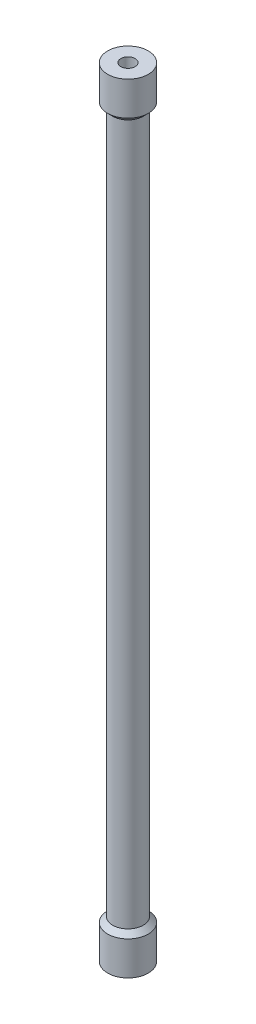
ISO-10303-21;
HEADER;
FILE_DESCRIPTION(('STEP AP214'),'2;1');
FILE_NAME('part.step','',(''),(''),'','','');
FILE_SCHEMA(('AUTOMOTIVE_DESIGN { 1 0 10303 214 1 1 1 1 }'));
ENDSEC;
DATA;
#1=APPLICATION_CONTEXT('core data for automotive mechanical design processes');
#2=APPLICATION_PROTOCOL_DEFINITION('international standard','automotive_design',2000,#1);
#3=PRODUCT_CONTEXT('',#1,'mechanical');
#4=PRODUCT('Part','Part','',(#3));
#5=PRODUCT_RELATED_PRODUCT_CATEGORY('part','',(#4));
#6=PRODUCT_DEFINITION_FORMATION('','',#4);
#7=PRODUCT_DEFINITION_CONTEXT('part definition',#1,'design');
#8=PRODUCT_DEFINITION('design','',#6,#7);
#9=PRODUCT_DEFINITION_SHAPE('','',#8);
#10=(LENGTH_UNIT() NAMED_UNIT(*) SI_UNIT(.MILLI.,.METRE.));
#11=(NAMED_UNIT(*) PLANE_ANGLE_UNIT() SI_UNIT($,.RADIAN.));
#12=(NAMED_UNIT(*) SI_UNIT($,.STERADIAN.) SOLID_ANGLE_UNIT());
#13=UNCERTAINTY_MEASURE_WITH_UNIT(LENGTH_MEASURE(1.E-05),#10,'distance_accuracy_value','');
#14=(GEOMETRIC_REPRESENTATION_CONTEXT(3) GLOBAL_UNCERTAINTY_ASSIGNED_CONTEXT((#13)) GLOBAL_UNIT_ASSIGNED_CONTEXT((#10,
#11,#12)) REPRESENTATION_CONTEXT('',''));
#15=CARTESIAN_POINT('',(0.,0.,0.));
#16=DIRECTION('',(0.,0.,1.));
#17=DIRECTION('',(1.,0.,0.));
#18=AXIS2_PLACEMENT_3D('',#15,#16,#17);
#19=CARTESIAN_POINT('',(0.,-115.,0.));
#20=DIRECTION('',(0.,1.,0.));
#21=DIRECTION('',(0.,0.,1.));
#22=AXIS2_PLACEMENT_3D('',#19,#20,#21);
#23=PLANE('',#22);
#24=CARTESIAN_POINT('',(0.,-115.,0.));
#25=DIRECTION('',(0.,1.,0.));
#26=DIRECTION('',(0.,0.,1.));
#27=AXIS2_PLACEMENT_3D('',#24,#25,#26);
#28=CIRCLE('',#27,6.);
#29=CARTESIAN_POINT('',(0.,-115.,6.));
#30=VERTEX_POINT('',#29);
#31=EDGE_CURVE('E82',#30,#30,#28,.T.);
#32=ORIENTED_EDGE('',*,*,#31,.F.);
#33=EDGE_LOOP('',(#32));
#34=FACE_BOUND('',#33,.T.);
#35=CARTESIAN_POINT('',(0.,-115.,0.));
#36=DIRECTION('',(0.,-1.,0.));
#37=DIRECTION('',(0.,0.,-1.));
#38=AXIS2_PLACEMENT_3D('',#35,#36,#37);
#39=CIRCLE('',#38,2.09999999999999);
#40=CARTESIAN_POINT('',(0.,-115.,-2.09999999999999));
#41=VERTEX_POINT('',#40);
#42=EDGE_CURVE('E65',#41,#41,#39,.T.);
#43=ORIENTED_EDGE('',*,*,#42,.F.);
#44=EDGE_LOOP('',(#43));
#45=FACE_BOUND('',#44,.T.);
#46=ADVANCED_FACE('F41',(#34,#45),#23,.F.);
#47=CARTESIAN_POINT('',(0.,115.,0.));
#48=DIRECTION('',(0.,-1.,0.));
#49=DIRECTION('',(0.,0.,-1.));
#50=AXIS2_PLACEMENT_3D('',#47,#48,#49);
#51=CYLINDRICAL_SURFACE('',#50,6.);
#52=CARTESIAN_POINT('',(0.,115.,0.));
#53=DIRECTION('',(0.,1.,0.));
#54=DIRECTION('',(0.,0.,1.));
#55=AXIS2_PLACEMENT_3D('',#52,#53,#54);
#56=CIRCLE('',#55,6.);
#57=CARTESIAN_POINT('',(0.,115.,6.));
#58=VERTEX_POINT('',#57);
#59=EDGE_CURVE('E83',#58,#58,#56,.T.);
#60=ORIENTED_EDGE('',*,*,#59,.F.);
#61=EDGE_LOOP('',(#60));
#62=FACE_BOUND('',#61,.T.);
#63=CARTESIAN_POINT('',(0.,105.,0.));
#64=DIRECTION('',(0.,1.,0.));
#65=DIRECTION('',(0.,0.,1.));
#66=AXIS2_PLACEMENT_3D('',#63,#64,#65);
#67=CIRCLE('',#66,6.);
#68=CARTESIAN_POINT('',(0.,105.,5.99999999999996));
#69=VERTEX_POINT('',#68);
#70=EDGE_CURVE('E79',#69,#69,#67,.T.);
#71=ORIENTED_EDGE('',*,*,#70,.T.);
#72=EDGE_LOOP('',(#71));
#73=FACE_BOUND('',#72,.T.);
#74=ADVANCED_FACE('F98',(#62,#73),#51,.T.);
#75=CARTESIAN_POINT('',(0.,115.,0.));
#76=DIRECTION('',(0.,1.,0.));
#77=DIRECTION('',(0.,0.,1.));
#78=AXIS2_PLACEMENT_3D('',#75,#76,#77);
#79=PLANE('',#78);
#80=CARTESIAN_POINT('',(0.,115.,0.));
#81=DIRECTION('',(0.,1.,0.));
#82=DIRECTION('',(0.,0.,1.));
#83=AXIS2_PLACEMENT_3D('',#80,#81,#82);
#84=CIRCLE('',#83,2.09999999999999);
#85=CARTESIAN_POINT('',(0.,115.,2.09999999999999));
#86=VERTEX_POINT('',#85);
#87=EDGE_CURVE('E66',#86,#86,#84,.T.);
#88=ORIENTED_EDGE('',*,*,#87,.F.);
#89=EDGE_LOOP('',(#88));
#90=FACE_BOUND('',#89,.T.);
#91=ORIENTED_EDGE('',*,*,#59,.T.);
#92=EDGE_LOOP('',(#91));
#93=FACE_BOUND('',#92,.T.);
#94=ADVANCED_FACE('F100',(#90,#93),#79,.T.);
#95=CARTESIAN_POINT('',(0.,115.,0.));
#96=DIRECTION('',(0.,1.,0.));
#97=DIRECTION('',(0.,0.,1.));
#98=AXIS2_PLACEMENT_3D('',#95,#96,#97);
#99=CYLINDRICAL_SURFACE('',#98,4.49999999999999);
#100=CARTESIAN_POINT('',(0.,-103.5,0.));
#101=DIRECTION('',(0.,1.,0.));
#102=DIRECTION('',(0.,0.,1.));
#103=AXIS2_PLACEMENT_3D('',#100,#101,#102);
#104=CIRCLE('',#103,4.49999999999999);
#105=CARTESIAN_POINT('',(0.,-103.5,4.49999999999999));
#106=VERTEX_POINT('',#105);
#107=EDGE_CURVE('E11',#106,#106,#104,.T.);
#108=ORIENTED_EDGE('',*,*,#107,.T.);
#109=EDGE_LOOP('',(#108));
#110=FACE_BOUND('',#109,.T.);
#111=CARTESIAN_POINT('',(0.,103.5,0.));
#112=DIRECTION('',(0.,-1.,0.));
#113=DIRECTION('',(0.,0.,-1.));
#114=AXIS2_PLACEMENT_3D('',#111,#112,#113);
#115=CIRCLE('',#114,4.49999999999999);
#116=CARTESIAN_POINT('',(0.,103.5,4.49999999999999));
#117=VERTEX_POINT('',#116);
#118=EDGE_CURVE('E49',#117,#117,#115,.T.);
#119=ORIENTED_EDGE('',*,*,#118,.T.);
#120=EDGE_LOOP('',(#119));
#121=FACE_BOUND('',#120,.T.);
#122=ADVANCED_FACE('F90',(#110,#121),#99,.T.);
#123=ORIENTED_EDGE('',*,*,#31,.T.);
#124=EDGE_LOOP('',(#123));
#125=FACE_BOUND('',#124,.T.);
#126=CARTESIAN_POINT('',(0.,-105.,0.));
#127=DIRECTION('',(0.,1.,0.));
#128=DIRECTION('',(0.,0.,1.));
#129=AXIS2_PLACEMENT_3D('',#126,#127,#128);
#130=CIRCLE('',#129,6.);
#131=CARTESIAN_POINT('',(0.,-105.,6.));
#132=VERTEX_POINT('',#131);
#133=EDGE_CURVE('E76',#132,#132,#130,.T.);
#134=ORIENTED_EDGE('',*,*,#133,.F.);
#135=EDGE_LOOP('',(#134));
#136=FACE_BOUND('',#135,.T.);
#137=ADVANCED_FACE('F103',(#125,#136),#51,.T.);
#138=CARTESIAN_POINT('',(0.,-103.5,0.));
#139=DIRECTION('',(0.,-1.,0.));
#140=DIRECTION('',(0.,0.,-1.));
#141=AXIS2_PLACEMENT_3D('',#138,#139,#140);
#142=CONICAL_SURFACE('',#141,4.49999999999999,0.785398163397435);
#143=ORIENTED_EDGE('',*,*,#133,.T.);
#144=EDGE_LOOP('',(#143));
#145=FACE_BOUND('',#144,.T.);
#146=ORIENTED_EDGE('',*,*,#107,.F.);
#147=EDGE_LOOP('',(#146));
#148=FACE_BOUND('',#147,.T.);
#149=ADVANCED_FACE('F95',(#145,#148),#142,.T.);
#150=CARTESIAN_POINT('',(0.,105.,0.));
#151=DIRECTION('',(0.,1.,0.));
#152=DIRECTION('',(0.,0.,1.));
#153=AXIS2_PLACEMENT_3D('',#150,#151,#152);
#154=CONICAL_SURFACE('',#153,5.99999999999995,0.78539816339744);
#155=CARTESIAN_POINT('',(0.,103.5,4.49999999999999));
#156=CARTESIAN_POINT('',(0.,103.515625,4.51562499999999));
#157=CARTESIAN_POINT('',(0.,103.53125,4.53124999999999));
#158=CARTESIAN_POINT('',(0.,103.5625,4.56249999999999));
#159=CARTESIAN_POINT('',(0.,103.578125,4.57812499999999));
#160=CARTESIAN_POINT('',(0.,103.609375,4.60937499999999));
#161=CARTESIAN_POINT('',(0.,103.625,4.62499999999999));
#162=CARTESIAN_POINT('',(0.,103.65625,4.65624999999999));
#163=CARTESIAN_POINT('',(0.,103.671875,4.67187499999999));
#164=CARTESIAN_POINT('',(0.,103.703125,4.70312499999999));
#165=CARTESIAN_POINT('',(0.,103.71875,4.71874999999999));
#166=CARTESIAN_POINT('',(0.,103.75,4.74999999999999));
#167=CARTESIAN_POINT('',(0.,103.765625,4.76562499999999));
#168=CARTESIAN_POINT('',(0.,103.796875,4.79687499999998));
#169=CARTESIAN_POINT('',(0.,103.8125,4.81249999999999));
#170=CARTESIAN_POINT('',(0.,103.84375,4.84374999999999));
#171=CARTESIAN_POINT('',(0.,103.859375,4.85937499999998));
#172=CARTESIAN_POINT('',(0.,103.890625,4.89062499999998));
#173=CARTESIAN_POINT('',(0.,103.90625,4.90624999999998));
#174=CARTESIAN_POINT('',(0.,103.9375,4.93749999999998));
#175=CARTESIAN_POINT('',(0.,103.953125,4.95312499999998));
#176=CARTESIAN_POINT('',(0.,103.984375,4.98437499999998));
#177=CARTESIAN_POINT('',(0.,104.,4.99999999999998));
#178=CARTESIAN_POINT('',(0.,104.03125,5.03124999999998));
#179=CARTESIAN_POINT('',(0.,104.046875,5.04687499999998));
#180=CARTESIAN_POINT('',(0.,104.078125,5.07812499999998));
#181=CARTESIAN_POINT('',(0.,104.09375,5.09374999999998));
#182=CARTESIAN_POINT('',(0.,104.125,5.12499999999998));
#183=CARTESIAN_POINT('',(0.,104.140625,5.14062499999998));
#184=CARTESIAN_POINT('',(0.,104.171875,5.17187499999998));
#185=CARTESIAN_POINT('',(0.,104.1875,5.18749999999998));
#186=CARTESIAN_POINT('',(0.,104.21875,5.21874999999998));
#187=CARTESIAN_POINT('',(0.,104.234375,5.23437499999998));
#188=CARTESIAN_POINT('',(0.,104.265625,5.26562499999998));
#189=CARTESIAN_POINT('',(0.,104.28125,5.28124999999997));
#190=CARTESIAN_POINT('',(0.,104.3125,5.31249999999997));
#191=CARTESIAN_POINT('',(0.,104.328125,5.32812499999997));
#192=CARTESIAN_POINT('',(0.,104.359375,5.35937499999997));
#193=CARTESIAN_POINT('',(0.,104.375,5.37499999999997));
#194=CARTESIAN_POINT('',(0.,104.40625,5.40624999999997));
#195=CARTESIAN_POINT('',(0.,104.421875,5.42187499999997));
#196=CARTESIAN_POINT('',(0.,104.453125,5.45312499999997));
#197=CARTESIAN_POINT('',(0.,104.46875,5.46874999999997));
#198=CARTESIAN_POINT('',(0.,104.5,5.49999999999997));
#199=CARTESIAN_POINT('',(0.,104.515625,5.51562499999997));
#200=CARTESIAN_POINT('',(0.,104.546875,5.54687499999997));
#201=CARTESIAN_POINT('',(0.,104.5625,5.56249999999997));
#202=CARTESIAN_POINT('',(0.,104.59375,5.59374999999997));
#203=CARTESIAN_POINT('',(0.,104.609375,5.60937499999997));
#204=CARTESIAN_POINT('',(0.,104.640625,5.64062499999997));
#205=CARTESIAN_POINT('',(0.,104.65625,5.65624999999996));
#206=CARTESIAN_POINT('',(0.,104.6875,5.68749999999996));
#207=CARTESIAN_POINT('',(0.,104.703125,5.70312499999997));
#208=CARTESIAN_POINT('',(0.,104.734375,5.73437499999996));
#209=CARTESIAN_POINT('',(0.,104.75,5.74999999999996));
#210=CARTESIAN_POINT('',(0.,104.78125,5.78124999999996));
#211=CARTESIAN_POINT('',(0.,104.796875,5.79687499999996));
#212=CARTESIAN_POINT('',(0.,104.828125,5.82812499999996));
#213=CARTESIAN_POINT('',(0.,104.84375,5.84374999999996));
#214=CARTESIAN_POINT('',(0.,104.875,5.87499999999996));
#215=CARTESIAN_POINT('',(0.,104.890625,5.89062499999996));
#216=CARTESIAN_POINT('',(0.,104.921875,5.92187499999996));
#217=CARTESIAN_POINT('',(0.,104.9375,5.93749999999996));
#218=CARTESIAN_POINT('',(0.,104.96875,5.96874999999996));
#219=CARTESIAN_POINT('',(0.,104.984375,5.98437499999995));
#220=CARTESIAN_POINT('',(0.,105.,5.99999999999996));
#221=B_SPLINE_CURVE_WITH_KNOTS('',3,(#155,#156,#157,#158,#159,#160,#161,#162,#163,#164,#165,
#166,#167,#168,#169,#170,#171,#172,#173,#174,#175,#176,#177,#178,#179,#180,#181,#182,#183,#184,
#185,#186,#187,#188,#189,#190,#191,#192,#193,#194,#195,#196,#197,#198,#199,#200,#201,#202,#203,
#204,#205,#206,#207,#208,#209,#210,#211,#212,#213,#214,#215,#216,#217,#218,#219,#220),
.UNSPECIFIED.,.F.,.F.,(4,2,2,2,2,2,2,2,2,2,2,2,2,2,2,2,2,2,2,2,2,2,2,2,2,2,2,2,2,2,2,2,4),(0.,
0.0662912607362395,0.132582521472479,0.198873782208718,0.265165042944957,0.331456303681196,
0.397747564417436,0.464038825153665,0.530330085889904,0.596621346626144,0.662912607362383,
0.729203868098622,0.795495128834862,0.861786389571091,0.92807765030733,0.99436891104357,
1.06066017177981,1.12695143251605,1.19324269325229,1.25953395398853,1.32582521472476,
1.39211647546099,1.45840773619723,1.52469899693347,1.59099025766971,1.65728151840595,
1.72357277914218,1.78986403987842,1.85615530061466,1.9224465613509,1.98873782208714,
2.05502908282338,2.12132034355961),.UNSPECIFIED.);
#222=EDGE_CURVE('BSEAM43',#117,#69,#221,.T.);
#223=ORIENTED_EDGE('',*,*,#118,.F.);
#224=ORIENTED_EDGE('',*,*,#70,.F.);
#225=ORIENTED_EDGE('',*,*,#222,.T.);
#226=ORIENTED_EDGE('',*,*,#222,.F.);
#227=EDGE_LOOP('',(#223,#225,#224,#226));
#228=FACE_BOUND('',#227,.T.);
#229=ADVANCED_FACE('F43',(#228),#154,.T.);
#230=CARTESIAN_POINT('',(0.,-97.6,0.));
#231=DIRECTION('',(0.,-1.,0.));
#232=DIRECTION('',(0.,0.,-1.));
#233=AXIS2_PLACEMENT_3D('',#230,#231,#232);
#234=CONICAL_SURFACE('',#233,2.1,1.02974425867665);
#235=CARTESIAN_POINT('',(0.,-96.3381927000421,0.));
#236=VERTEX_POINT('',#235);
#237=VERTEX_LOOP('',#236);
#238=FACE_BOUND('',#237,.T.);
#239=CARTESIAN_POINT('',(0.,-97.6,0.));
#240=DIRECTION('',(0.,-1.,0.));
#241=DIRECTION('',(0.,0.,-1.));
#242=AXIS2_PLACEMENT_3D('',#239,#240,#241);
#243=CIRCLE('',#242,2.1);
#244=CARTESIAN_POINT('',(0.,-97.6,-2.1));
#245=VERTEX_POINT('',#244);
#246=EDGE_CURVE('E69',#245,#245,#243,.T.);
#247=ORIENTED_EDGE('',*,*,#246,.T.);
#248=EDGE_LOOP('',(#247));
#249=FACE_BOUND('',#248,.T.);
#250=ADVANCED_FACE('F94',(#238,#249),#234,.F.);
#251=CARTESIAN_POINT('',(0.,-115.,0.));
#252=DIRECTION('',(0.,-1.,0.));
#253=DIRECTION('',(0.,0.,-1.));
#254=AXIS2_PLACEMENT_3D('',#251,#252,#253);
#255=CYLINDRICAL_SURFACE('',#254,2.09999999999999);
#256=ORIENTED_EDGE('',*,*,#246,.F.);
#257=EDGE_LOOP('',(#256));
#258=FACE_BOUND('',#257,.T.);
#259=ORIENTED_EDGE('',*,*,#42,.T.);
#260=EDGE_LOOP('',(#259));
#261=FACE_BOUND('',#260,.T.);
#262=ADVANCED_FACE('F59',(#258,#261),#255,.F.);
#263=CARTESIAN_POINT('',(0.,97.6,0.));
#264=DIRECTION('',(0.,1.,0.));
#265=DIRECTION('',(0.,0.,1.));
#266=AXIS2_PLACEMENT_3D('',#263,#264,#265);
#267=CONICAL_SURFACE('',#266,2.1,1.02974425867665);
#268=CARTESIAN_POINT('',(0.,96.3381927000421,0.));
#269=VERTEX_POINT('',#268);
#270=VERTEX_LOOP('',#269);
#271=FACE_BOUND('',#270,.T.);
#272=CARTESIAN_POINT('',(0.,97.6,0.));
#273=DIRECTION('',(0.,1.,0.));
#274=DIRECTION('',(0.,0.,1.));
#275=AXIS2_PLACEMENT_3D('',#272,#273,#274);
#276=CIRCLE('',#275,2.1);
#277=CARTESIAN_POINT('',(0.,97.6,2.1));
#278=VERTEX_POINT('',#277);
#279=EDGE_CURVE('E63',#278,#278,#276,.T.);
#280=ORIENTED_EDGE('',*,*,#279,.T.);
#281=EDGE_LOOP('',(#280));
#282=FACE_BOUND('',#281,.T.);
#283=ADVANCED_FACE('F55',(#271,#282),#267,.F.);
#284=CARTESIAN_POINT('',(0.,115.,0.));
#285=DIRECTION('',(0.,1.,0.));
#286=DIRECTION('',(0.,0.,1.));
#287=AXIS2_PLACEMENT_3D('',#284,#285,#286);
#288=CYLINDRICAL_SURFACE('',#287,2.09999999999999);
#289=ORIENTED_EDGE('',*,*,#279,.F.);
#290=EDGE_LOOP('',(#289));
#291=FACE_BOUND('',#290,.T.);
#292=ORIENTED_EDGE('',*,*,#87,.T.);
#293=EDGE_LOOP('',(#292));
#294=FACE_BOUND('',#293,.T.);
#295=ADVANCED_FACE('F58',(#291,#294),#288,.F.);
#296=CLOSED_SHELL('',(#46,#74,#94,#122,#137,#149,#229,#250,#262,#283,#295));
#297=MANIFOLD_SOLID_BREP('B2',#296);
#298=ADVANCED_BREP_SHAPE_REPRESENTATION('',(#18,#297),#14);
#299=SHAPE_DEFINITION_REPRESENTATION(#9,#298);
ENDSEC;
END-ISO-10303-21;
